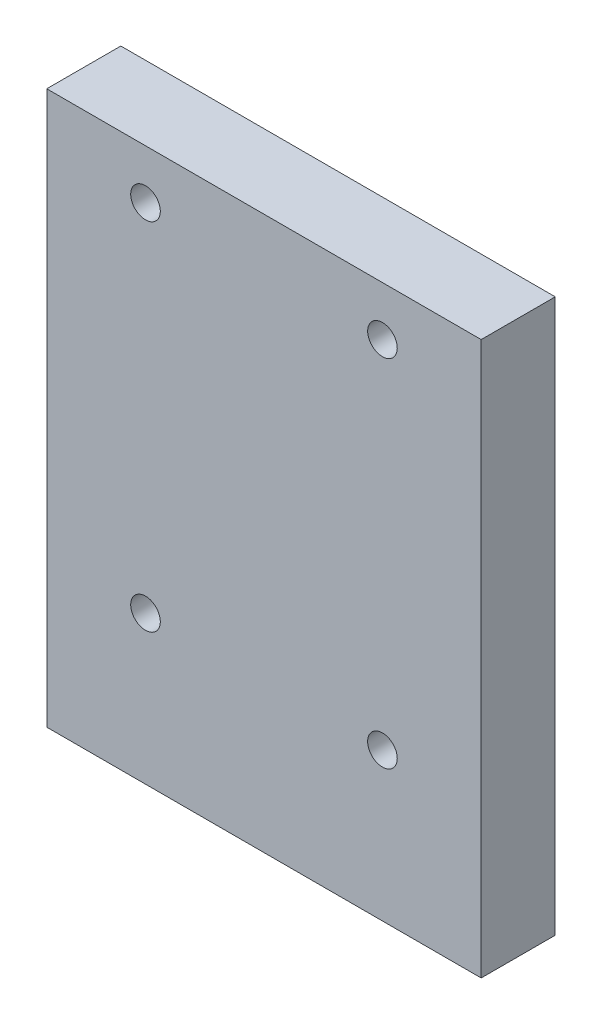
ISO-10303-21;
HEADER;
FILE_DESCRIPTION(('STEP AP214'),'2;1');
FILE_NAME('part.step','',(''),(''),'','','');
FILE_SCHEMA(('AUTOMOTIVE_DESIGN { 1 0 10303 214 1 1 1 1 }'));
ENDSEC;
DATA;
#1=APPLICATION_CONTEXT('core data for automotive mechanical design processes');
#2=APPLICATION_PROTOCOL_DEFINITION('international standard','automotive_design',2000,#1);
#3=PRODUCT_CONTEXT('',#1,'mechanical');
#4=PRODUCT('Part','Part','',(#3));
#5=PRODUCT_RELATED_PRODUCT_CATEGORY('part','',(#4));
#6=PRODUCT_DEFINITION_FORMATION('','',#4);
#7=PRODUCT_DEFINITION_CONTEXT('part definition',#1,'design');
#8=PRODUCT_DEFINITION('design','',#6,#7);
#9=PRODUCT_DEFINITION_SHAPE('','',#8);
#10=(LENGTH_UNIT() NAMED_UNIT(*) SI_UNIT(.MILLI.,.METRE.));
#11=(NAMED_UNIT(*) PLANE_ANGLE_UNIT() SI_UNIT($,.RADIAN.));
#12=(NAMED_UNIT(*) SI_UNIT($,.STERADIAN.) SOLID_ANGLE_UNIT());
#13=UNCERTAINTY_MEASURE_WITH_UNIT(LENGTH_MEASURE(1.E-05),#10,'distance_accuracy_value','');
#14=(GEOMETRIC_REPRESENTATION_CONTEXT(3) GLOBAL_UNCERTAINTY_ASSIGNED_CONTEXT((#13)) GLOBAL_UNIT_ASSIGNED_CONTEXT((#10,
#11,#12)) REPRESENTATION_CONTEXT('',''));
#15=CARTESIAN_POINT('',(0.,0.,0.));
#16=DIRECTION('',(0.,0.,1.));
#17=DIRECTION('',(1.,0.,0.));
#18=AXIS2_PLACEMENT_3D('',#15,#16,#17);
#19=CARTESIAN_POINT('',(22.,0.,7.5));
#20=DIRECTION('',(1.,0.,0.));
#21=DIRECTION('',(0.,1.,0.));
#22=AXIS2_PLACEMENT_3D('',#19,#20,#21);
#23=PLANE('',#22);
#24=DIRECTION('',(0.,-1.,0.));
#25=VECTOR('',#24,1.);
#26=CARTESIAN_POINT('',(22.,0.,0.));
#27=LINE('',#26,#25);
#28=CARTESIAN_POINT('',(22.,23.,0.));
#29=VERTEX_POINT('',#28);
#30=CARTESIAN_POINT('',(22.,-33.,0.));
#31=VERTEX_POINT('',#30);
#32=EDGE_CURVE('E119',#29,#31,#27,.T.);
#33=ORIENTED_EDGE('',*,*,#32,.F.);
#34=DIRECTION('',(0.,0.,-1.));
#35=VECTOR('',#34,1.);
#36=CARTESIAN_POINT('',(22.,23.,7.5));
#37=LINE('',#36,#35);
#38=CARTESIAN_POINT('',(22.,23.,7.5));
#39=VERTEX_POINT('',#38);
#40=EDGE_CURVE('E11',#39,#29,#37,.T.);
#41=ORIENTED_EDGE('',*,*,#40,.F.);
#42=DIRECTION('',(0.,-1.,0.));
#43=VECTOR('',#42,1.);
#44=CARTESIAN_POINT('',(22.,0.,7.5));
#45=LINE('',#44,#43);
#46=CARTESIAN_POINT('',(22.,-33.,7.5));
#47=VERTEX_POINT('',#46);
#48=EDGE_CURVE('E99',#39,#47,#45,.T.);
#49=ORIENTED_EDGE('',*,*,#48,.T.);
#50=DIRECTION('',(0.,0.,-1.));
#51=VECTOR('',#50,1.);
#52=CARTESIAN_POINT('',(22.,-33.,7.5));
#53=LINE('',#52,#51);
#54=EDGE_CURVE('E78',#47,#31,#53,.T.);
#55=ORIENTED_EDGE('',*,*,#54,.T.);
#56=EDGE_LOOP('',(#33,#41,#49,#55));
#57=FACE_BOUND('',#56,.T.);
#58=ADVANCED_FACE('F38',(#57),#23,.T.);
#59=CARTESIAN_POINT('',(0.,23.,7.5));
#60=DIRECTION('',(0.,1.,0.));
#61=DIRECTION('',(0.,0.,1.));
#62=AXIS2_PLACEMENT_3D('',#59,#60,#61);
#63=PLANE('',#62);
#64=DIRECTION('',(1.,0.,0.));
#65=VECTOR('',#64,1.);
#66=CARTESIAN_POINT('',(0.,23.,0.));
#67=LINE('',#66,#65);
#68=CARTESIAN_POINT('',(-22.,23.,0.));
#69=VERTEX_POINT('',#68);
#70=EDGE_CURVE('E90',#69,#29,#67,.T.);
#71=ORIENTED_EDGE('',*,*,#70,.F.);
#72=DIRECTION('',(0.,0.,-1.));
#73=VECTOR('',#72,1.);
#74=CARTESIAN_POINT('',(-22.,23.,7.5));
#75=LINE('',#74,#73);
#76=CARTESIAN_POINT('',(-22.,23.,7.5));
#77=VERTEX_POINT('',#76);
#78=EDGE_CURVE('E47',#77,#69,#75,.T.);
#79=ORIENTED_EDGE('',*,*,#78,.F.);
#80=DIRECTION('',(1.,0.,0.));
#81=VECTOR('',#80,1.);
#82=CARTESIAN_POINT('',(0.,23.,7.5));
#83=LINE('',#82,#81);
#84=EDGE_CURVE('E88',#77,#39,#83,.T.);
#85=ORIENTED_EDGE('',*,*,#84,.T.);
#86=ORIENTED_EDGE('',*,*,#40,.T.);
#87=EDGE_LOOP('',(#71,#79,#85,#86));
#88=FACE_BOUND('',#87,.T.);
#89=ADVANCED_FACE('F86',(#88),#63,.T.);
#90=CARTESIAN_POINT('',(-22.,0.,7.5));
#91=DIRECTION('',(1.,0.,0.));
#92=DIRECTION('',(0.,1.,0.));
#93=AXIS2_PLACEMENT_3D('',#90,#91,#92);
#94=PLANE('',#93);
#95=DIRECTION('',(0.,-1.,0.));
#96=VECTOR('',#95,1.);
#97=CARTESIAN_POINT('',(-22.,0.,0.));
#98=LINE('',#97,#96);
#99=CARTESIAN_POINT('',(-22.,-33.,0.));
#100=VERTEX_POINT('',#99);
#101=EDGE_CURVE('E122',#69,#100,#98,.T.);
#102=ORIENTED_EDGE('',*,*,#101,.T.);
#103=DIRECTION('',(0.,0.,-1.));
#104=VECTOR('',#103,1.);
#105=CARTESIAN_POINT('',(-22.,-33.,7.5));
#106=LINE('',#105,#104);
#107=CARTESIAN_POINT('',(-22.,-33.,7.5));
#108=VERTEX_POINT('',#107);
#109=EDGE_CURVE('E93',#108,#100,#106,.T.);
#110=ORIENTED_EDGE('',*,*,#109,.F.);
#111=DIRECTION('',(0.,-1.,0.));
#112=VECTOR('',#111,1.);
#113=CARTESIAN_POINT('',(-22.,0.,7.5));
#114=LINE('',#113,#112);
#115=EDGE_CURVE('E95',#77,#108,#114,.T.);
#116=ORIENTED_EDGE('',*,*,#115,.F.);
#117=ORIENTED_EDGE('',*,*,#78,.T.);
#118=EDGE_LOOP('',(#102,#110,#116,#117));
#119=FACE_BOUND('',#118,.T.);
#120=ADVANCED_FACE('F96',(#119),#94,.F.);
#121=CARTESIAN_POINT('',(-12.,18.,7.5));
#122=DIRECTION('',(0.,0.,-1.));
#123=DIRECTION('',(-1.,0.,0.));
#124=AXIS2_PLACEMENT_3D('',#121,#122,#123);
#125=CYLINDRICAL_SURFACE('',#124,1.5);
#126=CARTESIAN_POINT('',(-12.,18.,7.5));
#127=DIRECTION('',(0.,0.,1.));
#128=DIRECTION('',(1.,0.,0.));
#129=AXIS2_PLACEMENT_3D('',#126,#127,#128);
#130=CIRCLE('',#129,1.5);
#131=CARTESIAN_POINT('',(-10.5,18.,7.5));
#132=VERTEX_POINT('',#131);
#133=EDGE_CURVE('E101',#132,#132,#130,.T.);
#134=ORIENTED_EDGE('',*,*,#133,.T.);
#135=EDGE_LOOP('',(#134));
#136=FACE_BOUND('',#135,.T.);
#137=CARTESIAN_POINT('',(-12.,18.,0.));
#138=DIRECTION('',(0.,0.,1.));
#139=DIRECTION('',(1.,0.,0.));
#140=AXIS2_PLACEMENT_3D('',#137,#138,#139);
#141=CIRCLE('',#140,1.5);
#142=CARTESIAN_POINT('',(-10.5,18.,0.));
#143=VERTEX_POINT('',#142);
#144=EDGE_CURVE('E116',#143,#143,#141,.T.);
#145=ORIENTED_EDGE('',*,*,#144,.F.);
#146=EDGE_LOOP('',(#145));
#147=FACE_BOUND('',#146,.T.);
#148=ADVANCED_FACE('F138',(#136,#147),#125,.F.);
#149=CARTESIAN_POINT('',(12.,18.,7.5));
#150=DIRECTION('',(0.,0.,-1.));
#151=DIRECTION('',(-1.,0.,0.));
#152=AXIS2_PLACEMENT_3D('',#149,#150,#151);
#153=CYLINDRICAL_SURFACE('',#152,1.5);
#154=CARTESIAN_POINT('',(12.,18.,7.5));
#155=DIRECTION('',(0.,0.,1.));
#156=DIRECTION('',(1.,0.,0.));
#157=AXIS2_PLACEMENT_3D('',#154,#155,#156);
#158=CIRCLE('',#157,1.5);
#159=CARTESIAN_POINT('',(13.5,18.,7.5));
#160=VERTEX_POINT('',#159);
#161=EDGE_CURVE('E328',#160,#160,#158,.T.);
#162=ORIENTED_EDGE('',*,*,#161,.T.);
#163=EDGE_LOOP('',(#162));
#164=FACE_BOUND('',#163,.T.);
#165=CARTESIAN_POINT('',(12.,18.,0.));
#166=DIRECTION('',(0.,0.,1.));
#167=DIRECTION('',(1.,0.,0.));
#168=AXIS2_PLACEMENT_3D('',#165,#166,#167);
#169=CIRCLE('',#168,1.5);
#170=CARTESIAN_POINT('',(13.5,18.,0.));
#171=VERTEX_POINT('',#170);
#172=EDGE_CURVE('E113',#171,#171,#169,.T.);
#173=ORIENTED_EDGE('',*,*,#172,.F.);
#174=EDGE_LOOP('',(#173));
#175=FACE_BOUND('',#174,.T.);
#176=ADVANCED_FACE('F141',(#164,#175),#153,.F.);
#177=CARTESIAN_POINT('',(12.,-18.,7.5));
#178=DIRECTION('',(0.,0.,-1.));
#179=DIRECTION('',(-1.,0.,0.));
#180=AXIS2_PLACEMENT_3D('',#177,#178,#179);
#181=CYLINDRICAL_SURFACE('',#180,1.5);
#182=CARTESIAN_POINT('',(12.,-18.,7.5));
#183=DIRECTION('',(0.,0.,1.));
#184=DIRECTION('',(1.,0.,0.));
#185=AXIS2_PLACEMENT_3D('',#182,#183,#184);
#186=CIRCLE('',#185,1.5);
#187=CARTESIAN_POINT('',(13.5,-18.,7.5));
#188=VERTEX_POINT('',#187);
#189=EDGE_CURVE('E155',#188,#188,#186,.T.);
#190=ORIENTED_EDGE('',*,*,#189,.T.);
#191=EDGE_LOOP('',(#190));
#192=FACE_BOUND('',#191,.T.);
#193=CARTESIAN_POINT('',(12.,-18.,0.));
#194=DIRECTION('',(0.,0.,1.));
#195=DIRECTION('',(1.,0.,0.));
#196=AXIS2_PLACEMENT_3D('',#193,#194,#195);
#197=CIRCLE('',#196,1.5);
#198=CARTESIAN_POINT('',(13.5,-18.,0.));
#199=VERTEX_POINT('',#198);
#200=EDGE_CURVE('E109',#199,#199,#197,.T.);
#201=ORIENTED_EDGE('',*,*,#200,.F.);
#202=EDGE_LOOP('',(#201));
#203=FACE_BOUND('',#202,.T.);
#204=ADVANCED_FACE('F144',(#192,#203),#181,.F.);
#205=CARTESIAN_POINT('',(-12.,-18.,7.5));
#206=DIRECTION('',(0.,0.,-1.));
#207=DIRECTION('',(-1.,0.,0.));
#208=AXIS2_PLACEMENT_3D('',#205,#206,#207);
#209=CYLINDRICAL_SURFACE('',#208,1.5);
#210=CARTESIAN_POINT('',(-12.,-18.,7.5));
#211=DIRECTION('',(0.,0.,1.));
#212=DIRECTION('',(1.,0.,0.));
#213=AXIS2_PLACEMENT_3D('',#210,#211,#212);
#214=CIRCLE('',#213,1.5);
#215=CARTESIAN_POINT('',(-10.5,-18.,7.5));
#216=VERTEX_POINT('',#215);
#217=EDGE_CURVE('E125',#216,#216,#214,.T.);
#218=ORIENTED_EDGE('',*,*,#217,.T.);
#219=EDGE_LOOP('',(#218));
#220=FACE_BOUND('',#219,.T.);
#221=CARTESIAN_POINT('',(-12.,-18.,0.));
#222=DIRECTION('',(0.,0.,1.));
#223=DIRECTION('',(1.,0.,0.));
#224=AXIS2_PLACEMENT_3D('',#221,#222,#223);
#225=CIRCLE('',#224,1.5);
#226=CARTESIAN_POINT('',(-10.5,-18.,0.));
#227=VERTEX_POINT('',#226);
#228=EDGE_CURVE('E106',#227,#227,#225,.T.);
#229=ORIENTED_EDGE('',*,*,#228,.F.);
#230=EDGE_LOOP('',(#229));
#231=FACE_BOUND('',#230,.T.);
#232=ADVANCED_FACE('F40',(#220,#231),#209,.F.);
#233=CARTESIAN_POINT('',(0.,-33.,7.5));
#234=DIRECTION('',(0.,1.,0.));
#235=DIRECTION('',(0.,0.,1.));
#236=AXIS2_PLACEMENT_3D('',#233,#234,#235);
#237=PLANE('',#236);
#238=CARTESIAN_POINT('',(-18.,-33.,3.75));
#239=DIRECTION('',(0.,-1.,0.));
#240=DIRECTION('',(0.,0.,-1.));
#241=AXIS2_PLACEMENT_3D('',#238,#239,#240);
#242=CIRCLE('',#241,1.5);
#243=CARTESIAN_POINT('',(-18.,-33.,2.25));
#244=VERTEX_POINT('',#243);
#245=EDGE_CURVE('E302',#244,#244,#242,.T.);
#246=ORIENTED_EDGE('',*,*,#245,.F.);
#247=EDGE_LOOP('',(#246));
#248=FACE_BOUND('',#247,.T.);
#249=CARTESIAN_POINT('',(-6.,-33.,3.75));
#250=DIRECTION('',(0.,-1.,0.));
#251=DIRECTION('',(0.,0.,-1.));
#252=AXIS2_PLACEMENT_3D('',#249,#250,#251);
#253=CIRCLE('',#252,1.5);
#254=CARTESIAN_POINT('',(-6.,-33.,2.25));
#255=VERTEX_POINT('',#254);
#256=EDGE_CURVE('E305',#255,#255,#253,.T.);
#257=ORIENTED_EDGE('',*,*,#256,.F.);
#258=EDGE_LOOP('',(#257));
#259=FACE_BOUND('',#258,.T.);
#260=CARTESIAN_POINT('',(6.,-33.,3.75));
#261=DIRECTION('',(0.,-1.,0.));
#262=DIRECTION('',(0.,0.,-1.));
#263=AXIS2_PLACEMENT_3D('',#260,#261,#262);
#264=CIRCLE('',#263,1.5);
#265=CARTESIAN_POINT('',(6.,-33.,2.25));
#266=VERTEX_POINT('',#265);
#267=EDGE_CURVE('E313',#266,#266,#264,.T.);
#268=ORIENTED_EDGE('',*,*,#267,.F.);
#269=EDGE_LOOP('',(#268));
#270=FACE_BOUND('',#269,.T.);
#271=CARTESIAN_POINT('',(18.,-33.,3.75));
#272=DIRECTION('',(0.,-1.,0.));
#273=DIRECTION('',(0.,0.,-1.));
#274=AXIS2_PLACEMENT_3D('',#271,#272,#273);
#275=CIRCLE('',#274,1.5);
#276=CARTESIAN_POINT('',(18.,-33.,2.25));
#277=VERTEX_POINT('',#276);
#278=EDGE_CURVE('E319',#277,#277,#275,.T.);
#279=ORIENTED_EDGE('',*,*,#278,.F.);
#280=EDGE_LOOP('',(#279));
#281=FACE_BOUND('',#280,.T.);
#282=DIRECTION('',(1.,0.,0.));
#283=VECTOR('',#282,1.);
#284=CARTESIAN_POINT('',(0.,-33.,0.));
#285=LINE('',#284,#283);
#286=EDGE_CURVE('E71',#100,#31,#285,.T.);
#287=ORIENTED_EDGE('',*,*,#286,.T.);
#288=ORIENTED_EDGE('',*,*,#54,.F.);
#289=DIRECTION('',(1.,0.,0.));
#290=VECTOR('',#289,1.);
#291=CARTESIAN_POINT('',(0.,-33.,7.5));
#292=LINE('',#291,#290);
#293=EDGE_CURVE('E55',#108,#47,#292,.T.);
#294=ORIENTED_EDGE('',*,*,#293,.F.);
#295=ORIENTED_EDGE('',*,*,#109,.T.);
#296=EDGE_LOOP('',(#287,#288,#294,#295));
#297=FACE_BOUND('',#296,.T.);
#298=ADVANCED_FACE('F128',(#248,#259,#270,#281,#297),#237,.F.);
#299=CARTESIAN_POINT('',(0.,0.,7.5));
#300=DIRECTION('',(0.,0.,1.));
#301=DIRECTION('',(1.,0.,0.));
#302=AXIS2_PLACEMENT_3D('',#299,#300,#301);
#303=PLANE('',#302);
#304=ORIENTED_EDGE('',*,*,#217,.F.);
#305=EDGE_LOOP('',(#304));
#306=FACE_BOUND('',#305,.T.);
#307=ORIENTED_EDGE('',*,*,#189,.F.);
#308=EDGE_LOOP('',(#307));
#309=FACE_BOUND('',#308,.T.);
#310=ORIENTED_EDGE('',*,*,#161,.F.);
#311=EDGE_LOOP('',(#310));
#312=FACE_BOUND('',#311,.T.);
#313=ORIENTED_EDGE('',*,*,#133,.F.);
#314=EDGE_LOOP('',(#313));
#315=FACE_BOUND('',#314,.T.);
#316=ORIENTED_EDGE('',*,*,#48,.F.);
#317=ORIENTED_EDGE('',*,*,#84,.F.);
#318=ORIENTED_EDGE('',*,*,#115,.T.);
#319=ORIENTED_EDGE('',*,*,#293,.T.);
#320=EDGE_LOOP('',(#316,#317,#318,#319));
#321=FACE_BOUND('',#320,.T.);
#322=ADVANCED_FACE('F98',(#306,#309,#312,#315,#321),#303,.T.);
#323=CARTESIAN_POINT('',(0.,0.,0.));
#324=DIRECTION('',(0.,0.,1.));
#325=DIRECTION('',(1.,0.,0.));
#326=AXIS2_PLACEMENT_3D('',#323,#324,#325);
#327=PLANE('',#326);
#328=ORIENTED_EDGE('',*,*,#228,.T.);
#329=EDGE_LOOP('',(#328));
#330=FACE_BOUND('',#329,.T.);
#331=ORIENTED_EDGE('',*,*,#200,.T.);
#332=EDGE_LOOP('',(#331));
#333=FACE_BOUND('',#332,.T.);
#334=ORIENTED_EDGE('',*,*,#172,.T.);
#335=EDGE_LOOP('',(#334));
#336=FACE_BOUND('',#335,.T.);
#337=ORIENTED_EDGE('',*,*,#144,.T.);
#338=EDGE_LOOP('',(#337));
#339=FACE_BOUND('',#338,.T.);
#340=ORIENTED_EDGE('',*,*,#32,.T.);
#341=ORIENTED_EDGE('',*,*,#286,.F.);
#342=ORIENTED_EDGE('',*,*,#101,.F.);
#343=ORIENTED_EDGE('',*,*,#70,.T.);
#344=EDGE_LOOP('',(#340,#341,#342,#343));
#345=FACE_BOUND('',#344,.T.);
#346=ADVANCED_FACE('F129',(#330,#333,#336,#339,#345),#327,.F.);
#347=CARTESIAN_POINT('',(18.,-30.,3.75));
#348=DIRECTION('',(0.,-1.,0.));
#349=DIRECTION('',(0.,0.,-1.));
#350=AXIS2_PLACEMENT_3D('',#347,#348,#349);
#351=CYLINDRICAL_SURFACE('',#350,1.5);
#352=CARTESIAN_POINT('',(18.,-30.,3.75));
#353=DIRECTION('',(0.,-1.,0.));
#354=DIRECTION('',(0.,0.,-1.));
#355=AXIS2_PLACEMENT_3D('',#352,#353,#354);
#356=CIRCLE('',#355,1.5);
#357=CARTESIAN_POINT('',(18.,-30.,2.25));
#358=VERTEX_POINT('',#357);
#359=EDGE_CURVE('E322',#358,#358,#356,.T.);
#360=ORIENTED_EDGE('',*,*,#359,.F.);
#361=EDGE_LOOP('',(#360));
#362=FACE_BOUND('',#361,.T.);
#363=ORIENTED_EDGE('',*,*,#278,.T.);
#364=EDGE_LOOP('',(#363));
#365=FACE_BOUND('',#364,.T.);
#366=ADVANCED_FACE('F160',(#362,#365),#351,.F.);
#367=CARTESIAN_POINT('',(18.,-30.,3.75));
#368=DIRECTION('',(0.,-1.,0.));
#369=DIRECTION('',(0.,0.,-1.));
#370=AXIS2_PLACEMENT_3D('',#367,#368,#369);
#371=PLANE('',#370);
#372=ORIENTED_EDGE('',*,*,#359,.T.);
#373=EDGE_LOOP('',(#372));
#374=FACE_BOUND('',#373,.T.);
#375=ADVANCED_FACE('F172',(#374),#371,.T.);
#376=CARTESIAN_POINT('',(6.,-30.,3.75));
#377=DIRECTION('',(0.,-1.,0.));
#378=DIRECTION('',(0.,0.,-1.));
#379=AXIS2_PLACEMENT_3D('',#376,#377,#378);
#380=CYLINDRICAL_SURFACE('',#379,1.5);
#381=CARTESIAN_POINT('',(6.,-30.,3.75));
#382=DIRECTION('',(0.,-1.,0.));
#383=DIRECTION('',(0.,0.,-1.));
#384=AXIS2_PLACEMENT_3D('',#381,#382,#383);
#385=CIRCLE('',#384,1.5);
#386=CARTESIAN_POINT('',(6.,-30.,2.25));
#387=VERTEX_POINT('',#386);
#388=EDGE_CURVE('E316',#387,#387,#385,.T.);
#389=ORIENTED_EDGE('',*,*,#388,.F.);
#390=EDGE_LOOP('',(#389));
#391=FACE_BOUND('',#390,.T.);
#392=ORIENTED_EDGE('',*,*,#267,.T.);
#393=EDGE_LOOP('',(#392));
#394=FACE_BOUND('',#393,.T.);
#395=ADVANCED_FACE('F237',(#391,#394),#380,.F.);
#396=CARTESIAN_POINT('',(6.,-30.,3.75));
#397=DIRECTION('',(0.,-1.,0.));
#398=DIRECTION('',(0.,0.,-1.));
#399=AXIS2_PLACEMENT_3D('',#396,#397,#398);
#400=PLANE('',#399);
#401=ORIENTED_EDGE('',*,*,#388,.T.);
#402=EDGE_LOOP('',(#401));
#403=FACE_BOUND('',#402,.T.);
#404=ADVANCED_FACE('F246',(#403),#400,.T.);
#405=CARTESIAN_POINT('',(-6.,-30.,3.75));
#406=DIRECTION('',(0.,-1.,0.));
#407=DIRECTION('',(0.,0.,-1.));
#408=AXIS2_PLACEMENT_3D('',#405,#406,#407);
#409=CYLINDRICAL_SURFACE('',#408,1.5);
#410=CARTESIAN_POINT('',(-6.,-30.,3.75));
#411=DIRECTION('',(0.,-1.,0.));
#412=DIRECTION('',(0.,0.,-1.));
#413=AXIS2_PLACEMENT_3D('',#410,#411,#412);
#414=CIRCLE('',#413,1.5);
#415=CARTESIAN_POINT('',(-6.,-30.,2.25));
#416=VERTEX_POINT('',#415);
#417=EDGE_CURVE('E310',#416,#416,#414,.T.);
#418=ORIENTED_EDGE('',*,*,#417,.F.);
#419=EDGE_LOOP('',(#418));
#420=FACE_BOUND('',#419,.T.);
#421=ORIENTED_EDGE('',*,*,#256,.T.);
#422=EDGE_LOOP('',(#421));
#423=FACE_BOUND('',#422,.T.);
#424=ADVANCED_FACE('F256',(#420,#423),#409,.F.);
#425=CARTESIAN_POINT('',(-6.,-30.,3.75));
#426=DIRECTION('',(0.,-1.,0.));
#427=DIRECTION('',(0.,0.,-1.));
#428=AXIS2_PLACEMENT_3D('',#425,#426,#427);
#429=PLANE('',#428);
#430=ORIENTED_EDGE('',*,*,#417,.T.);
#431=EDGE_LOOP('',(#430));
#432=FACE_BOUND('',#431,.T.);
#433=ADVANCED_FACE('F266',(#432),#429,.T.);
#434=CARTESIAN_POINT('',(-18.,-30.,3.75));
#435=DIRECTION('',(0.,-1.,0.));
#436=DIRECTION('',(0.,0.,-1.));
#437=AXIS2_PLACEMENT_3D('',#434,#435,#436);
#438=CYLINDRICAL_SURFACE('',#437,1.5);
#439=CARTESIAN_POINT('',(-18.,-30.,3.75));
#440=DIRECTION('',(0.,-1.,0.));
#441=DIRECTION('',(0.,0.,-1.));
#442=AXIS2_PLACEMENT_3D('',#439,#440,#441);
#443=CIRCLE('',#442,1.5);
#444=CARTESIAN_POINT('',(-18.,-30.,2.25));
#445=VERTEX_POINT('',#444);
#446=EDGE_CURVE('E110',#445,#445,#443,.T.);
#447=ORIENTED_EDGE('',*,*,#446,.F.);
#448=EDGE_LOOP('',(#447));
#449=FACE_BOUND('',#448,.T.);
#450=ORIENTED_EDGE('',*,*,#245,.T.);
#451=EDGE_LOOP('',(#450));
#452=FACE_BOUND('',#451,.T.);
#453=ADVANCED_FACE('F276',(#449,#452),#438,.F.);
#454=CARTESIAN_POINT('',(-18.,-30.,3.75));
#455=DIRECTION('',(0.,-1.,0.));
#456=DIRECTION('',(0.,0.,-1.));
#457=AXIS2_PLACEMENT_3D('',#454,#455,#456);
#458=PLANE('',#457);
#459=ORIENTED_EDGE('',*,*,#446,.T.);
#460=EDGE_LOOP('',(#459));
#461=FACE_BOUND('',#460,.T.);
#462=ADVANCED_FACE('F286',(#461),#458,.T.);
#463=CLOSED_SHELL('',(#58,#89,#120,#148,#176,#204,#232,#298,#322,#346,#366,#375,#395,#404,#424,
#433,#453,#462));
#464=MANIFOLD_SOLID_BREP('B2',#463);
#465=ADVANCED_BREP_SHAPE_REPRESENTATION('',(#18,#464),#14);
#466=SHAPE_DEFINITION_REPRESENTATION(#9,#465);
ENDSEC;
END-ISO-10303-21;
